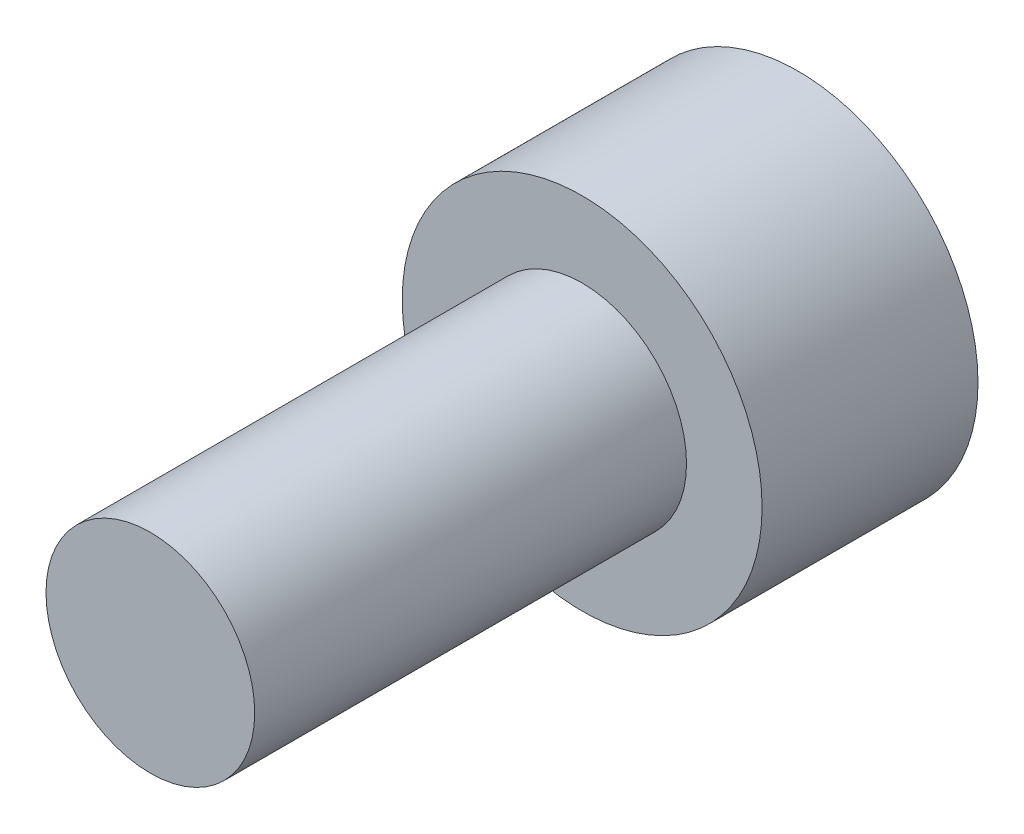
ISO-10303-21;
HEADER;
FILE_DESCRIPTION(('STEP AP214'),'2;1');
FILE_NAME('part.step','',(''),(''),'','','');
FILE_SCHEMA(('AUTOMOTIVE_DESIGN { 1 0 10303 214 1 1 1 1 }'));
ENDSEC;
DATA;
#1=APPLICATION_CONTEXT('core data for automotive mechanical design processes');
#2=APPLICATION_PROTOCOL_DEFINITION('international standard','automotive_design',2000,#1);
#3=PRODUCT_CONTEXT('',#1,'mechanical');
#4=PRODUCT('Part','Part','',(#3));
#5=PRODUCT_RELATED_PRODUCT_CATEGORY('part','',(#4));
#6=PRODUCT_DEFINITION_FORMATION('','',#4);
#7=PRODUCT_DEFINITION_CONTEXT('part definition',#1,'design');
#8=PRODUCT_DEFINITION('design','',#6,#7);
#9=PRODUCT_DEFINITION_SHAPE('','',#8);
#10=(LENGTH_UNIT() NAMED_UNIT(*) SI_UNIT(.MILLI.,.METRE.));
#11=(NAMED_UNIT(*) PLANE_ANGLE_UNIT() SI_UNIT($,.RADIAN.));
#12=(NAMED_UNIT(*) SI_UNIT($,.STERADIAN.) SOLID_ANGLE_UNIT());
#13=UNCERTAINTY_MEASURE_WITH_UNIT(LENGTH_MEASURE(1.E-05),#10,'distance_accuracy_value','');
#14=(GEOMETRIC_REPRESENTATION_CONTEXT(3) GLOBAL_UNCERTAINTY_ASSIGNED_CONTEXT((#13)) GLOBAL_UNIT_ASSIGNED_CONTEXT((#10,
#11,#12)) REPRESENTATION_CONTEXT('',''));
#15=CARTESIAN_POINT('',(0.,0.,0.));
#16=DIRECTION('',(0.,0.,1.));
#17=DIRECTION('',(1.,0.,0.));
#18=AXIS2_PLACEMENT_3D('',#15,#16,#17);
#19=CARTESIAN_POINT('',(0.,0.,18.));
#20=DIRECTION('',(0.,0.,-1.));
#21=DIRECTION('',(-1.,0.,0.));
#22=AXIS2_PLACEMENT_3D('',#19,#20,#21);
#23=CYLINDRICAL_SURFACE('',#22,2.9);
#24=CARTESIAN_POINT('',(0.,0.,6.));
#25=DIRECTION('',(0.,0.,1.));
#26=DIRECTION('',(1.,0.,0.));
#27=AXIS2_PLACEMENT_3D('',#24,#25,#26);
#28=CIRCLE('',#27,2.9);
#29=CARTESIAN_POINT('',(2.9,0.,6.));
#30=VERTEX_POINT('',#29);
#31=EDGE_CURVE('E58',#30,#30,#28,.T.);
#32=ORIENTED_EDGE('',*,*,#31,.T.);
#33=EDGE_LOOP('',(#32));
#34=FACE_BOUND('',#33,.T.);
#35=CARTESIAN_POINT('',(0.,0.,18.));
#36=DIRECTION('',(0.,0.,1.));
#37=DIRECTION('',(1.,0.,0.));
#38=AXIS2_PLACEMENT_3D('',#35,#36,#37);
#39=CIRCLE('',#38,2.9);
#40=CARTESIAN_POINT('',(2.9,0.,18.));
#41=VERTEX_POINT('',#40);
#42=EDGE_CURVE('E12',#41,#41,#39,.T.);
#43=ORIENTED_EDGE('',*,*,#42,.F.);
#44=EDGE_LOOP('',(#43));
#45=FACE_BOUND('',#44,.T.);
#46=ADVANCED_FACE('F47',(#34,#45),#23,.T.);
#47=CARTESIAN_POINT('',(0.,0.,18.));
#48=DIRECTION('',(0.,0.,1.));
#49=DIRECTION('',(1.,0.,0.));
#50=AXIS2_PLACEMENT_3D('',#47,#48,#49);
#51=PLANE('',#50);
#52=ORIENTED_EDGE('',*,*,#42,.T.);
#53=EDGE_LOOP('',(#52));
#54=FACE_BOUND('',#53,.T.);
#55=ADVANCED_FACE('F82',(#54),#51,.T.);
#56=CARTESIAN_POINT('',(0.,0.,6.));
#57=DIRECTION('',(0.,0.,-1.));
#58=DIRECTION('',(-1.,0.,0.));
#59=AXIS2_PLACEMENT_3D('',#56,#57,#58);
#60=CYLINDRICAL_SURFACE('',#59,5.);
#61=CARTESIAN_POINT('',(0.,0.,6.));
#62=DIRECTION('',(0.,0.,1.));
#63=DIRECTION('',(1.,0.,0.));
#64=AXIS2_PLACEMENT_3D('',#61,#62,#63);
#65=CIRCLE('',#64,5.);
#66=CARTESIAN_POINT('',(5.,0.,6.));
#67=VERTEX_POINT('',#66);
#68=EDGE_CURVE('E53',#67,#67,#65,.T.);
#69=ORIENTED_EDGE('',*,*,#68,.F.);
#70=EDGE_LOOP('',(#69));
#71=FACE_BOUND('',#70,.T.);
#72=CARTESIAN_POINT('',(0.,0.,0.));
#73=DIRECTION('',(0.,0.,1.));
#74=DIRECTION('',(1.,0.,0.));
#75=AXIS2_PLACEMENT_3D('',#72,#73,#74);
#76=CIRCLE('',#75,5.);
#77=CARTESIAN_POINT('',(5.,0.,0.));
#78=VERTEX_POINT('',#77);
#79=EDGE_CURVE('E65',#78,#78,#76,.T.);
#80=ORIENTED_EDGE('',*,*,#79,.T.);
#81=EDGE_LOOP('',(#80));
#82=FACE_BOUND('',#81,.T.);
#83=ADVANCED_FACE('F70',(#71,#82),#60,.T.);
#84=CARTESIAN_POINT('',(0.,0.,6.));
#85=DIRECTION('',(0.,0.,1.));
#86=DIRECTION('',(1.,0.,0.));
#87=AXIS2_PLACEMENT_3D('',#84,#85,#86);
#88=PLANE('',#87);
#89=ORIENTED_EDGE('',*,*,#31,.F.);
#90=EDGE_LOOP('',(#89));
#91=FACE_BOUND('',#90,.T.);
#92=ORIENTED_EDGE('',*,*,#68,.T.);
#93=EDGE_LOOP('',(#92));
#94=FACE_BOUND('',#93,.T.);
#95=ADVANCED_FACE('F74',(#91,#94),#88,.T.);
#96=CARTESIAN_POINT('',(0.,0.,0.));
#97=DIRECTION('',(0.,0.,1.));
#98=DIRECTION('',(1.,0.,0.));
#99=AXIS2_PLACEMENT_3D('',#96,#97,#98);
#100=PLANE('',#99);
#101=ORIENTED_EDGE('',*,*,#79,.F.);
#102=EDGE_LOOP('',(#101));
#103=FACE_BOUND('',#102,.T.);
#104=ADVANCED_FACE('F72',(#103),#100,.F.);
#105=CLOSED_SHELL('',(#46,#55,#83,#95,#104));
#106=MANIFOLD_SOLID_BREP('B2',#105);
#107=ADVANCED_BREP_SHAPE_REPRESENTATION('',(#18,#106),#14);
#108=SHAPE_DEFINITION_REPRESENTATION(#9,#107);
ENDSEC;
END-ISO-10303-21;
